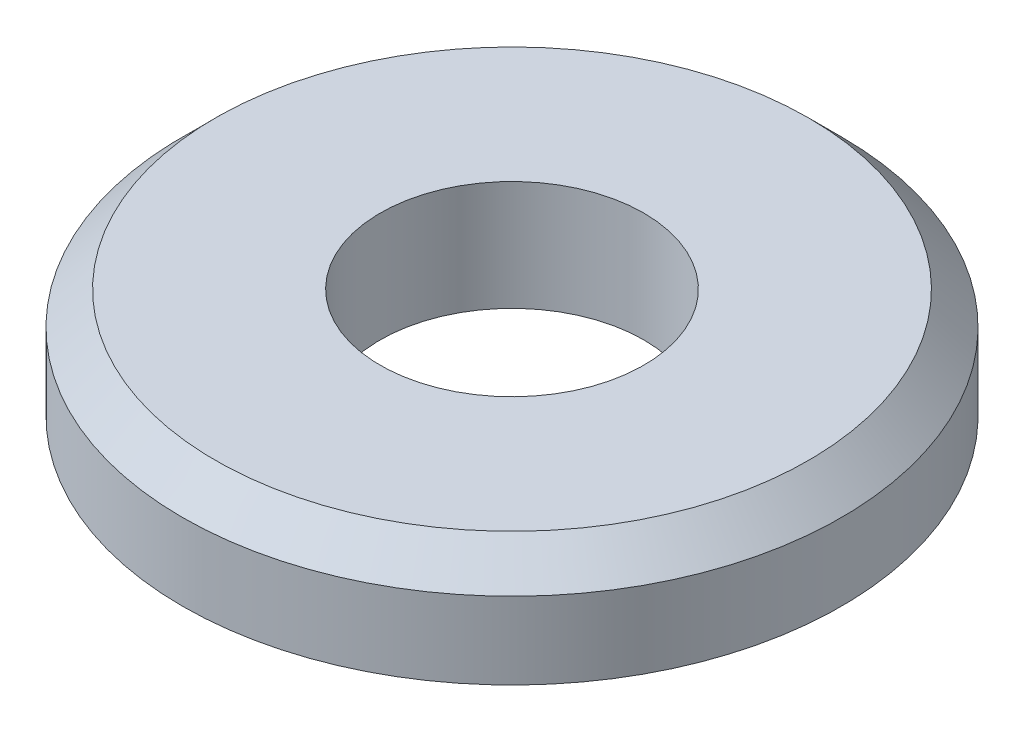
ISO-10303-21;
HEADER;
FILE_DESCRIPTION(('STEP AP214'),'2;1');
FILE_NAME('part.step','',(''),(''),'','','');
FILE_SCHEMA(('AUTOMOTIVE_DESIGN { 1 0 10303 214 1 1 1 1 }'));
ENDSEC;
DATA;
#1=APPLICATION_CONTEXT('core data for automotive mechanical design processes');
#2=APPLICATION_PROTOCOL_DEFINITION('international standard','automotive_design',2000,#1);
#3=PRODUCT_CONTEXT('',#1,'mechanical');
#4=PRODUCT('Part','Part','',(#3));
#5=PRODUCT_RELATED_PRODUCT_CATEGORY('part','',(#4));
#6=PRODUCT_DEFINITION_FORMATION('','',#4);
#7=PRODUCT_DEFINITION_CONTEXT('part definition',#1,'design');
#8=PRODUCT_DEFINITION('design','',#6,#7);
#9=PRODUCT_DEFINITION_SHAPE('','',#8);
#10=(LENGTH_UNIT() NAMED_UNIT(*) SI_UNIT(.MILLI.,.METRE.));
#11=(NAMED_UNIT(*) PLANE_ANGLE_UNIT() SI_UNIT($,.RADIAN.));
#12=(NAMED_UNIT(*) SI_UNIT($,.STERADIAN.) SOLID_ANGLE_UNIT());
#13=UNCERTAINTY_MEASURE_WITH_UNIT(LENGTH_MEASURE(1.E-05),#10,'distance_accuracy_value','');
#14=(GEOMETRIC_REPRESENTATION_CONTEXT(3) GLOBAL_UNCERTAINTY_ASSIGNED_CONTEXT((#13)) GLOBAL_UNIT_ASSIGNED_CONTEXT((#10,
#11,#12)) REPRESENTATION_CONTEXT('',''));
#15=CARTESIAN_POINT('',(0.,0.,0.));
#16=DIRECTION('',(0.,0.,1.));
#17=DIRECTION('',(1.,0.,0.));
#18=AXIS2_PLACEMENT_3D('',#15,#16,#17);
#19=CARTESIAN_POINT('',(0.,0.,-15.));
#20=DIRECTION('',(0.,-1.,0.));
#21=DIRECTION('',(0.,0.,-1.));
#22=AXIS2_PLACEMENT_3D('',#19,#20,#21);
#23=PLANE('',#22);
#24=CARTESIAN_POINT('',(0.,0.,0.));
#25=DIRECTION('',(0.,-1.,0.));
#26=DIRECTION('',(0.,0.,-1.));
#27=AXIS2_PLACEMENT_3D('',#24,#25,#26);
#28=CIRCLE('',#27,15.);
#29=CARTESIAN_POINT('',(0.,0.,-15.));
#30=VERTEX_POINT('',#29);
#31=EDGE_CURVE('E53',#30,#30,#28,.T.);
#32=ORIENTED_EDGE('',*,*,#31,.T.);
#33=EDGE_LOOP('',(#32));
#34=FACE_BOUND('',#33,.T.);
#35=CARTESIAN_POINT('',(0.,0.,0.));
#36=DIRECTION('',(0.,-1.,0.));
#37=DIRECTION('',(0.,0.,-1.));
#38=AXIS2_PLACEMENT_3D('',#35,#36,#37);
#39=CIRCLE('',#38,6.);
#40=CARTESIAN_POINT('',(0.,0.,-6.));
#41=VERTEX_POINT('',#40);
#42=EDGE_CURVE('E10',#41,#41,#39,.T.);
#43=ORIENTED_EDGE('',*,*,#42,.F.);
#44=EDGE_LOOP('',(#43));
#45=FACE_BOUND('',#44,.T.);
#46=ADVANCED_FACE('F34',(#34,#45),#23,.T.);
#47=CARTESIAN_POINT('',(0.,0.,0.));
#48=DIRECTION('',(0.,-1.,0.));
#49=DIRECTION('',(0.,0.,-1.));
#50=AXIS2_PLACEMENT_3D('',#47,#48,#49);
#51=CYLINDRICAL_SURFACE('',#50,6.);
#52=ORIENTED_EDGE('',*,*,#42,.T.);
#53=EDGE_LOOP('',(#52));
#54=FACE_BOUND('',#53,.T.);
#55=CARTESIAN_POINT('',(0.,5.,0.));
#56=DIRECTION('',(0.,-1.,0.));
#57=DIRECTION('',(0.,0.,-1.));
#58=AXIS2_PLACEMENT_3D('',#55,#56,#57);
#59=CIRCLE('',#58,6.);
#60=CARTESIAN_POINT('',(0.,5.,-6.));
#61=VERTEX_POINT('',#60);
#62=EDGE_CURVE('E40',#61,#61,#59,.T.);
#63=ORIENTED_EDGE('',*,*,#62,.F.);
#64=EDGE_LOOP('',(#63));
#65=FACE_BOUND('',#64,.T.);
#66=ADVANCED_FACE('F71',(#54,#65),#51,.F.);
#67=CARTESIAN_POINT('',(0.,5.,-6.));
#68=DIRECTION('',(0.,1.,0.));
#69=DIRECTION('',(0.,0.,1.));
#70=AXIS2_PLACEMENT_3D('',#67,#68,#69);
#71=PLANE('',#70);
#72=ORIENTED_EDGE('',*,*,#62,.T.);
#73=EDGE_LOOP('',(#72));
#74=FACE_BOUND('',#73,.T.);
#75=CARTESIAN_POINT('',(0.,5.,0.));
#76=DIRECTION('',(0.,-1.,0.));
#77=DIRECTION('',(0.,0.,-1.));
#78=AXIS2_PLACEMENT_3D('',#75,#76,#77);
#79=CIRCLE('',#78,13.5);
#80=CARTESIAN_POINT('',(0.,5.,-13.5));
#81=VERTEX_POINT('',#80);
#82=EDGE_CURVE('E44',#81,#81,#79,.T.);
#83=ORIENTED_EDGE('',*,*,#82,.F.);
#84=EDGE_LOOP('',(#83));
#85=FACE_BOUND('',#84,.T.);
#86=ADVANCED_FACE('F67',(#74,#85),#71,.T.);
#87=CARTESIAN_POINT('',(0.,3.5,0.));
#88=DIRECTION('',(0.,-1.,0.));
#89=DIRECTION('',(0.,0.,-1.));
#90=AXIS2_PLACEMENT_3D('',#87,#88,#89);
#91=CONICAL_SURFACE('',#90,15.,0.785398163397446);
#92=ORIENTED_EDGE('',*,*,#82,.T.);
#93=EDGE_LOOP('',(#92));
#94=FACE_BOUND('',#93,.T.);
#95=CARTESIAN_POINT('',(0.,3.5,0.));
#96=DIRECTION('',(0.,-1.,0.));
#97=DIRECTION('',(0.,0.,-1.));
#98=AXIS2_PLACEMENT_3D('',#95,#96,#97);
#99=CIRCLE('',#98,15.);
#100=CARTESIAN_POINT('',(0.,3.5,-15.));
#101=VERTEX_POINT('',#100);
#102=EDGE_CURVE('E48',#101,#101,#99,.T.);
#103=ORIENTED_EDGE('',*,*,#102,.F.);
#104=EDGE_LOOP('',(#103));
#105=FACE_BOUND('',#104,.T.);
#106=ADVANCED_FACE('F61',(#94,#105),#91,.T.);
#107=CARTESIAN_POINT('',(0.,0.,0.));
#108=DIRECTION('',(0.,-1.,0.));
#109=DIRECTION('',(0.,0.,-1.));
#110=AXIS2_PLACEMENT_3D('',#107,#108,#109);
#111=CYLINDRICAL_SURFACE('',#110,15.);
#112=ORIENTED_EDGE('',*,*,#102,.T.);
#113=EDGE_LOOP('',(#112));
#114=FACE_BOUND('',#113,.T.);
#115=ORIENTED_EDGE('',*,*,#31,.F.);
#116=EDGE_LOOP('',(#115));
#117=FACE_BOUND('',#116,.T.);
#118=ADVANCED_FACE('F59',(#114,#117),#111,.T.);
#119=CLOSED_SHELL('',(#46,#66,#86,#106,#118));
#120=MANIFOLD_SOLID_BREP('B2',#119);
#121=ADVANCED_BREP_SHAPE_REPRESENTATION('',(#18,#120),#14);
#122=SHAPE_DEFINITION_REPRESENTATION(#9,#121);
ENDSEC;
END-ISO-10303-21;
